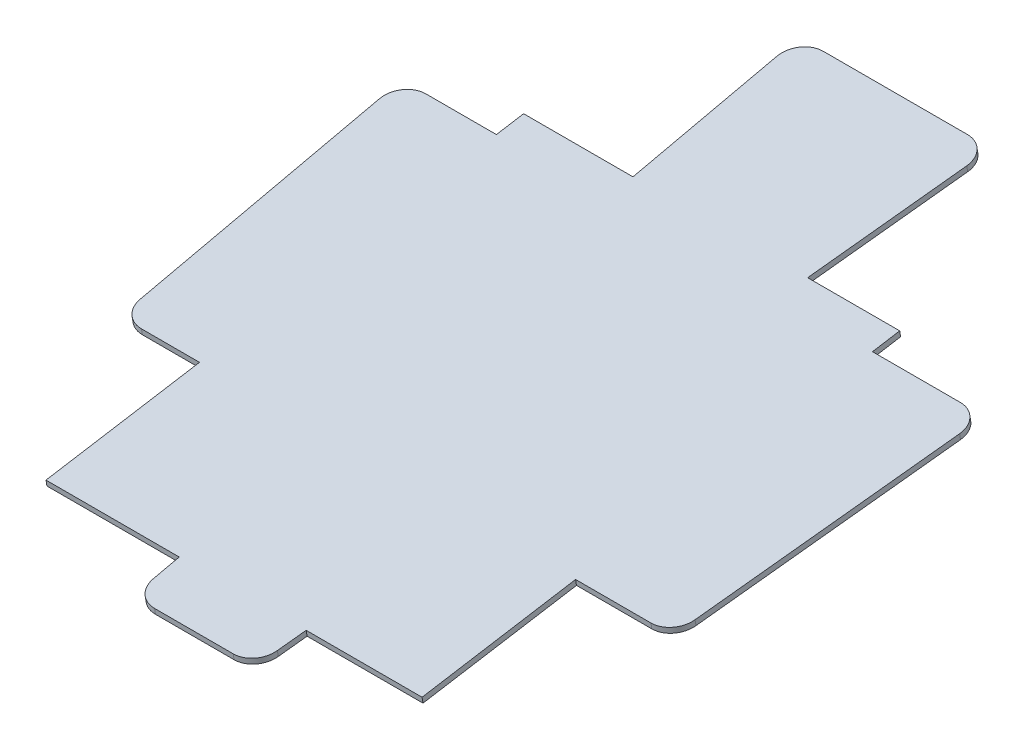
ISO-10303-21;
HEADER;
FILE_DESCRIPTION(('STEP AP214'),'2;1');
FILE_NAME('part.step','',(''),(''),'','','');
FILE_SCHEMA(('AUTOMOTIVE_DESIGN { 1 0 10303 214 1 1 1 1 }'));
ENDSEC;
DATA;
#1=APPLICATION_CONTEXT('core data for automotive mechanical design processes');
#2=APPLICATION_PROTOCOL_DEFINITION('international standard','automotive_design',2000,#1);
#3=PRODUCT_CONTEXT('',#1,'mechanical');
#4=PRODUCT('Part','Part','',(#3));
#5=PRODUCT_RELATED_PRODUCT_CATEGORY('part','',(#4));
#6=PRODUCT_DEFINITION_FORMATION('','',#4);
#7=PRODUCT_DEFINITION_CONTEXT('part definition',#1,'design');
#8=PRODUCT_DEFINITION('design','',#6,#7);
#9=PRODUCT_DEFINITION_SHAPE('','',#8);
#10=(LENGTH_UNIT() NAMED_UNIT(*) SI_UNIT(.MILLI.,.METRE.));
#11=(NAMED_UNIT(*) PLANE_ANGLE_UNIT() SI_UNIT($,.RADIAN.));
#12=(NAMED_UNIT(*) SI_UNIT($,.STERADIAN.) SOLID_ANGLE_UNIT());
#13=UNCERTAINTY_MEASURE_WITH_UNIT(LENGTH_MEASURE(1.E-05),#10,'distance_accuracy_value','');
#14=(GEOMETRIC_REPRESENTATION_CONTEXT(3) GLOBAL_UNCERTAINTY_ASSIGNED_CONTEXT((#13)) GLOBAL_UNIT_ASSIGNED_CONTEXT((#10,
#11,#12)) REPRESENTATION_CONTEXT('',''));
#15=CARTESIAN_POINT('',(0.,0.,0.));
#16=DIRECTION('',(0.,0.,1.));
#17=DIRECTION('',(1.,0.,0.));
#18=AXIS2_PLACEMENT_3D('',#15,#16,#17);
#19=CARTESIAN_POINT('',(35.3768313671058,430.23976657494,1311.19693575289));
#20=DIRECTION('',(0.,-0.16217195826243,0.98676251243819));
#21=DIRECTION('',(0.,-0.98676251243819,-0.16217195826243));
#22=AXIS2_PLACEMENT_3D('',#19,#20,#21);
#23=PLANE('',#22);
#24=DIRECTION('',(1.,0.,0.));
#25=VECTOR('',#24,1.);
#26=CARTESIAN_POINT('',(35.3768313671058,433.372737551937,1311.71183172037));
#27=LINE('',#26,#25);
#28=CARTESIAN_POINT('',(35.3768313671058,433.372737551937,1311.71183172037));
#29=VERTEX_POINT('',#28);
#30=CARTESIAN_POINT('',(99.9999999999999,433.372737551937,1311.71183172037));
#31=VERTEX_POINT('',#30);
#32=EDGE_CURVE('E299',#29,#31,#27,.T.);
#33=ORIENTED_EDGE('',*,*,#32,.F.);
#34=DIRECTION('',(0.,0.98676251243819,0.16217195826243));
#35=VECTOR('',#34,1.);
#36=CARTESIAN_POINT('',(35.3768313671058,430.23976657494,1311.19693575289));
#37=LINE('',#36,#35);
#38=CARTESIAN_POINT('',(35.3768313671058,430.23976657494,1311.19693575289));
#39=VERTEX_POINT('',#38);
#40=EDGE_CURVE('E249',#39,#29,#37,.T.);
#41=ORIENTED_EDGE('',*,*,#40,.F.);
#42=DIRECTION('',(1.,0.,0.));
#43=VECTOR('',#42,1.);
#44=CARTESIAN_POINT('',(35.3768313671058,430.23976657494,1311.19693575289));
#45=LINE('',#44,#43);
#46=CARTESIAN_POINT('',(99.9999999999999,430.23976657494,1311.19693575289));
#47=VERTEX_POINT('',#46);
#48=EDGE_CURVE('E244',#39,#47,#45,.T.);
#49=ORIENTED_EDGE('',*,*,#48,.T.);
#50=DIRECTION('',(0.,0.98676251243819,0.16217195826243));
#51=VECTOR('',#50,1.);
#52=CARTESIAN_POINT('',(99.9999999999999,430.23976657494,1311.19693575289));
#53=LINE('',#52,#51);
#54=EDGE_CURVE('E228',#47,#31,#53,.T.);
#55=ORIENTED_EDGE('',*,*,#54,.T.);
#56=EDGE_LOOP('',(#33,#41,#49,#55));
#57=FACE_BOUND('',#56,.T.);
#58=ADVANCED_FACE('F41',(#57),#23,.T.);
#59=CARTESIAN_POINT('',(35.3768313671058,430.23976657494,1311.19693575289));
#60=DIRECTION('',(0.9987850922731,-0.00799153965595833,0.0486258649994334));
#61=DIRECTION('',(0.0486274178120991,0.,-0.998816987359009));
#62=AXIS2_PLACEMENT_3D('',#59,#60,#61);
#63=PLANE('',#62);
#64=DIRECTION('',(0.0492781843518598,0.161974934297251,-0.985563687037213));
#65=VECTOR('',#64,1.);
#66=CARTESIAN_POINT('',(35.3768313671058,433.372737551937,1311.71183172037));
#67=LINE('',#66,#65);
#68=CARTESIAN_POINT('',(34.6117878065813,430.858077523766,1327.01270293086));
#69=VERTEX_POINT('',#68);
#70=EDGE_CURVE('E250',#69,#29,#67,.T.);
#71=ORIENTED_EDGE('',*,*,#70,.F.);
#72=DIRECTION('',(0.,0.98676251243819,0.16217195826243));
#73=VECTOR('',#72,1.);
#74=CARTESIAN_POINT('',(34.6117878065813,427.725106546769,1326.49780696338));
#75=LINE('',#74,#73);
#76=CARTESIAN_POINT('',(34.6117878065813,427.725106546769,1326.49780696338));
#77=VERTEX_POINT('',#76);
#78=EDGE_CURVE('E394',#69,#77,#75,.F.);
#79=ORIENTED_EDGE('',*,*,#78,.T.);
#80=DIRECTION('',(0.0492781843518598,0.161974934297251,-0.985563687037213));
#81=VECTOR('',#80,1.);
#82=CARTESIAN_POINT('',(35.3768313671058,430.23976657494,1311.19693575289));
#83=LINE('',#82,#81);
#84=EDGE_CURVE('E239',#77,#39,#83,.T.);
#85=ORIENTED_EDGE('',*,*,#84,.T.);
#86=ORIENTED_EDGE('',*,*,#40,.T.);
#87=EDGE_LOOP('',(#71,#79,#85,#86));
#88=FACE_BOUND('',#87,.T.);
#89=ADVANCED_FACE('F461',(#88),#63,.T.);
#90=CARTESIAN_POINT('',(34.0160710354577,425.767015230467,1338.41214238585));
#91=DIRECTION('',(0.,-0.16217195826243,0.98676251243819));
#92=DIRECTION('',(0.,-0.98676251243819,-0.16217195826243));
#93=AXIS2_PLACEMENT_3D('',#90,#91,#92);
#94=PLANE('',#93);
#95=DIRECTION('',(1.,0.,0.));
#96=VECTOR('',#95,1.);
#97=CARTESIAN_POINT('',(34.0160710354577,425.767015230467,1338.41214238585));
#98=LINE('',#97,#96);
#99=CARTESIAN_POINT('',(-21.9272171347127,425.767015230467,1338.41214238585));
#100=VERTEX_POINT('',#99);
#101=CARTESIAN_POINT('',(21.927217134713,425.767015230467,1338.41214238585));
#102=VERTEX_POINT('',#101);
#103=EDGE_CURVE('E295',#100,#102,#98,.T.);
#104=ORIENTED_EDGE('',*,*,#103,.T.);
#105=DIRECTION('',(0.,0.98676251243819,0.16217195826243));
#106=VECTOR('',#105,1.);
#107=CARTESIAN_POINT('',(21.927217134713,425.767015230467,1338.41214238585));
#108=LINE('',#107,#106);
#109=CARTESIAN_POINT('',(21.927217134713,428.899986207464,1338.92703835334));
#110=VERTEX_POINT('',#109);
#111=EDGE_CURVE('E375',#102,#110,#108,.T.);
#112=ORIENTED_EDGE('',*,*,#111,.T.);
#113=DIRECTION('',(1.,0.,0.));
#114=VECTOR('',#113,1.);
#115=CARTESIAN_POINT('',(34.0160710354577,428.899986207464,1338.92703835334));
#116=LINE('',#115,#114);
#117=CARTESIAN_POINT('',(-21.9272171347127,428.899986207464,1338.92703835334));
#118=VERTEX_POINT('',#117);
#119=EDGE_CURVE('E252',#118,#110,#116,.T.);
#120=ORIENTED_EDGE('',*,*,#119,.F.);
#121=DIRECTION('',(0.,0.98676251243819,0.16217195826243));
#122=VECTOR('',#121,1.);
#123=CARTESIAN_POINT('',(-21.9272171347127,425.767015230467,1338.41214238585));
#124=LINE('',#123,#122);
#125=EDGE_CURVE('E350',#118,#100,#124,.F.);
#126=ORIENTED_EDGE('',*,*,#125,.T.);
#127=EDGE_LOOP('',(#104,#112,#120,#126));
#128=FACE_BOUND('',#127,.T.);
#129=ADVANCED_FACE('F469',(#128),#94,.T.);
#130=CARTESIAN_POINT('',(-35.3768313671055,430.23976657494,1311.19693575289));
#131=DIRECTION('',(-0.9987850922731,-0.00799153965595796,0.0486258649994335));
#132=DIRECTION('',(0.0486274178120992,0.,0.998816987359009));
#133=AXIS2_PLACEMENT_3D('',#130,#131,#132);
#134=PLANE('',#133);
#135=DIRECTION('',(0.0492781843518598,-0.161974934297251,0.985563687037213));
#136=VECTOR('',#135,1.);
#137=CARTESIAN_POINT('',(-35.3768313671055,430.23976657494,1311.19693575289));
#138=LINE('',#137,#136);
#139=CARTESIAN_POINT('',(-35.3768313671055,430.23976657494,1311.19693575289));
#140=VERTEX_POINT('',#139);
#141=CARTESIAN_POINT('',(-34.6117878065811,427.725106546769,1326.49780696338));
#142=VERTEX_POINT('',#141);
#143=EDGE_CURVE('E292',#140,#142,#138,.T.);
#144=ORIENTED_EDGE('',*,*,#143,.T.);
#145=DIRECTION('',(0.,0.98676251243819,0.16217195826243));
#146=VECTOR('',#145,1.);
#147=CARTESIAN_POINT('',(-34.6117878065811,427.725106546769,1326.49780696338));
#148=LINE('',#147,#146);
#149=CARTESIAN_POINT('',(-34.6117878065811,430.858077523766,1327.01270293086));
#150=VERTEX_POINT('',#149);
#151=EDGE_CURVE('E410',#142,#150,#148,.T.);
#152=ORIENTED_EDGE('',*,*,#151,.T.);
#153=DIRECTION('',(0.0492781843518598,-0.161974934297251,0.985563687037213));
#154=VECTOR('',#153,1.);
#155=CARTESIAN_POINT('',(-35.3768313671055,433.372737551937,1311.71183172037));
#156=LINE('',#155,#154);
#157=CARTESIAN_POINT('',(-35.3768313671055,433.372737551937,1311.71183172037));
#158=VERTEX_POINT('',#157);
#159=EDGE_CURVE('E344',#158,#150,#156,.T.);
#160=ORIENTED_EDGE('',*,*,#159,.F.);
#161=DIRECTION('',(0.,0.98676251243819,0.16217195826243));
#162=VECTOR('',#161,1.);
#163=CARTESIAN_POINT('',(-35.3768313671055,430.23976657494,1311.19693575289));
#164=LINE('',#163,#162);
#165=EDGE_CURVE('E351',#140,#158,#164,.T.);
#166=ORIENTED_EDGE('',*,*,#165,.F.);
#167=EDGE_LOOP('',(#144,#152,#160,#166));
#168=FACE_BOUND('',#167,.T.);
#169=ADVANCED_FACE('F477',(#168),#134,.T.);
#170=CARTESIAN_POINT('',(-100.,430.23976657494,1311.19693575289));
#171=DIRECTION('',(0.,-0.16217195826243,0.98676251243819));
#172=DIRECTION('',(0.,-0.98676251243819,-0.16217195826243));
#173=AXIS2_PLACEMENT_3D('',#170,#171,#172);
#174=PLANE('',#173);
#175=DIRECTION('',(1.,0.,0.));
#176=VECTOR('',#175,1.);
#177=CARTESIAN_POINT('',(-100.,433.372737551937,1311.71183172037));
#178=LINE('',#177,#176);
#179=CARTESIAN_POINT('',(-109.652,433.372737551937,1311.71183172037));
#180=VERTEX_POINT('',#179);
#181=EDGE_CURVE('E341',#180,#158,#178,.T.);
#182=ORIENTED_EDGE('',*,*,#181,.F.);
#183=DIRECTION('',(0.,0.98676251243819,0.16217195826243));
#184=VECTOR('',#183,1.);
#185=CARTESIAN_POINT('',(-109.652,430.23976657494,1311.19693575289));
#186=LINE('',#185,#184);
#187=CARTESIAN_POINT('',(-109.652,430.23976657494,1311.19693575289));
#188=VERTEX_POINT('',#187);
#189=EDGE_CURVE('E353',#188,#180,#186,.T.);
#190=ORIENTED_EDGE('',*,*,#189,.F.);
#191=DIRECTION('',(1.,0.,0.));
#192=VECTOR('',#191,1.);
#193=CARTESIAN_POINT('',(-100.,430.23976657494,1311.19693575289));
#194=LINE('',#193,#192);
#195=EDGE_CURVE('E290',#188,#140,#194,.T.);
#196=ORIENTED_EDGE('',*,*,#195,.T.);
#197=ORIENTED_EDGE('',*,*,#165,.T.);
#198=EDGE_LOOP('',(#182,#190,#196,#197));
#199=FACE_BOUND('',#198,.T.);
#200=ADVANCED_FACE('F726',(#199),#174,.T.);
#201=CARTESIAN_POINT('',(-109.652,430.23976657494,1311.19693575289));
#202=DIRECTION('',(-1.,0.,0.));
#203=DIRECTION('',(0.,0.,1.));
#204=AXIS2_PLACEMENT_3D('',#201,#202,#203);
#205=PLANE('',#204);
#206=DIRECTION('',(0.,-0.16217195826243,0.98676251243819));
#207=VECTOR('',#206,1.);
#208=CARTESIAN_POINT('',(-109.652,433.372737551937,1311.71183172037));
#209=LINE('',#208,#207);
#210=CARTESIAN_POINT('',(-109.651999999999,447.43624103686,1226.14008318165));
#211=VERTEX_POINT('',#210);
#212=EDGE_CURVE('E338',#211,#180,#209,.T.);
#213=ORIENTED_EDGE('',*,*,#212,.F.);
#214=DIRECTION('',(0.,0.98676251243819,0.16217195826243));
#215=VECTOR('',#214,1.);
#216=CARTESIAN_POINT('',(-109.651999999999,444.303270059863,1225.62518721417));
#217=LINE('',#216,#215);
#218=CARTESIAN_POINT('',(-109.651999999999,444.303270059863,1225.62518721417));
#219=VERTEX_POINT('',#218);
#220=EDGE_CURVE('E356',#219,#211,#217,.T.);
#221=ORIENTED_EDGE('',*,*,#220,.F.);
#222=DIRECTION('',(0.,-0.16217195826243,0.98676251243819));
#223=VECTOR('',#222,1.);
#224=CARTESIAN_POINT('',(-109.652,430.23976657494,1311.19693575289));
#225=LINE('',#224,#223);
#226=EDGE_CURVE('E287',#219,#188,#225,.T.);
#227=ORIENTED_EDGE('',*,*,#226,.T.);
#228=ORIENTED_EDGE('',*,*,#189,.T.);
#229=EDGE_LOOP('',(#213,#221,#227,#228));
#230=FACE_BOUND('',#229,.T.);
#231=ADVANCED_FACE('F487',(#230),#205,.T.);
#232=CARTESIAN_POINT('',(-109.651999999999,444.303270059863,1225.62518721417));
#233=DIRECTION('',(0.,-0.16217195826243,0.98676251243819));
#234=DIRECTION('',(0.,-0.98676251243819,-0.16217195826243));
#235=AXIS2_PLACEMENT_3D('',#232,#233,#234);
#236=PLANE('',#235);
#237=DIRECTION('',(1.,0.,0.));
#238=VECTOR('',#237,1.);
#239=CARTESIAN_POINT('',(-109.651999999999,447.43624103686,1226.14008318165));
#240=LINE('',#239,#238);
#241=CARTESIAN_POINT('',(-142.005597758584,447.43624103686,1226.14008318165));
#242=VERTEX_POINT('',#241);
#243=EDGE_CURVE('E336',#242,#211,#240,.T.);
#244=ORIENTED_EDGE('',*,*,#243,.F.);
#245=DIRECTION('',(0.,0.98676251243819,0.16217195826243));
#246=VECTOR('',#245,1.);
#247=CARTESIAN_POINT('',(-142.005597758584,444.303270059863,1225.62518721417));
#248=LINE('',#247,#246);
#249=CARTESIAN_POINT('',(-142.005597758584,444.303270059863,1225.62518721417));
#250=VERTEX_POINT('',#249);
#251=EDGE_CURVE('E418',#242,#250,#248,.F.);
#252=ORIENTED_EDGE('',*,*,#251,.T.);
#253=DIRECTION('',(1.,0.,0.));
#254=VECTOR('',#253,1.);
#255=CARTESIAN_POINT('',(-109.651999999999,444.303270059863,1225.62518721417));
#256=LINE('',#255,#254);
#257=EDGE_CURVE('E285',#250,#219,#256,.T.);
#258=ORIENTED_EDGE('',*,*,#257,.T.);
#259=ORIENTED_EDGE('',*,*,#220,.T.);
#260=EDGE_LOOP('',(#244,#252,#258,#259));
#261=FACE_BOUND('',#260,.T.);
#262=ADVANCED_FACE('F490',(#261),#236,.T.);
#263=CARTESIAN_POINT('',(-154.094451659329,444.303270059863,1225.62518721417));
#264=DIRECTION('',(-0.9987850922731,-0.00799153965595822,0.0486258649994351));
#265=DIRECTION('',(0.0486274178121008,0.,0.998816987359009));
#266=AXIS2_PLACEMENT_3D('',#263,#264,#265);
#267=PLANE('',#266);
#268=DIRECTION('',(0.0492781843518614,-0.161974934297251,0.985563687037213));
#269=VECTOR('',#268,1.);
#270=CARTESIAN_POINT('',(-154.094451659329,444.303270059863,1225.62518721417));
#271=LINE('',#270,#269);
#272=CARTESIAN_POINT('',(-161.712782277747,469.344342851059,1073.25857484581));
#273=VERTEX_POINT('',#272);
#274=CARTESIAN_POINT('',(-154.690168430453,446.261361376165,1213.71085179169));
#275=VERTEX_POINT('',#274);
#276=EDGE_CURVE('E282',#273,#275,#271,.T.);
#277=ORIENTED_EDGE('',*,*,#276,.T.);
#278=DIRECTION('',(0.,0.98676251243819,0.16217195826243));
#279=VECTOR('',#278,1.);
#280=CARTESIAN_POINT('',(-154.690168430453,446.261361376165,1213.71085179169));
#281=LINE('',#280,#279);
#282=CARTESIAN_POINT('',(-154.690168430453,449.394332353162,1214.22574775918));
#283=VERTEX_POINT('',#282);
#284=EDGE_CURVE('E415',#275,#283,#281,.T.);
#285=ORIENTED_EDGE('',*,*,#284,.T.);
#286=DIRECTION('',(0.0492781843518614,-0.161974934297251,0.985563687037213));
#287=VECTOR('',#286,1.);
#288=CARTESIAN_POINT('',(-154.094451659329,447.43624103686,1226.14008318165));
#289=LINE('',#288,#287);
#290=CARTESIAN_POINT('',(-161.712782277747,472.477313828056,1073.77347081329));
#291=VERTEX_POINT('',#290);
#292=EDGE_CURVE('E333',#291,#283,#289,.T.);
#293=ORIENTED_EDGE('',*,*,#292,.F.);
#294=DIRECTION('',(0.,0.98676251243819,0.16217195826243));
#295=VECTOR('',#294,1.);
#296=CARTESIAN_POINT('',(-161.712782277747,469.344342851059,1073.25857484581));
#297=LINE('',#296,#295);
#298=EDGE_CURVE('E413',#291,#273,#297,.F.);
#299=ORIENTED_EDGE('',*,*,#298,.T.);
#300=EDGE_LOOP('',(#277,#285,#293,#299));
#301=FACE_BOUND('',#300,.T.);
#302=ADVANCED_FACE('F499',(#301),#267,.T.);
#303=CARTESIAN_POINT('',(-109.651999999999,471.505419274623,1060.10914245235));
#304=DIRECTION('',(0.,0.16217195826243,-0.98676251243819));
#305=DIRECTION('',(0.,0.98676251243819,0.16217195826243));
#306=AXIS2_PLACEMENT_3D('',#303,#304,#305);
#307=PLANE('',#306);
#308=DIRECTION('',(-1.,0.,0.));
#309=VECTOR('',#308,1.);
#310=CARTESIAN_POINT('',(-109.651999999999,471.505419274623,1060.10914245235));
#311=LINE('',#310,#309);
#312=CARTESIAN_POINT('',(-109.651999999999,471.505419274623,1060.10914245235));
#313=VERTEX_POINT('',#312);
#314=CARTESIAN_POINT('',(-149.028211605879,471.505419274623,1060.10914245235));
#315=VERTEX_POINT('',#314);
#316=EDGE_CURVE('E279',#313,#315,#311,.T.);
#317=ORIENTED_EDGE('',*,*,#316,.T.);
#318=DIRECTION('',(0.,0.98676251243819,0.16217195826243));
#319=VECTOR('',#318,1.);
#320=CARTESIAN_POINT('',(-149.028211605879,471.505419274623,1060.10914245235));
#321=LINE('',#320,#319);
#322=CARTESIAN_POINT('',(-149.028211605879,474.63839025162,1060.62403841984));
#323=VERTEX_POINT('',#322);
#324=EDGE_CURVE('E420',#315,#323,#321,.T.);
#325=ORIENTED_EDGE('',*,*,#324,.T.);
#326=DIRECTION('',(-1.,0.,0.));
#327=VECTOR('',#326,1.);
#328=CARTESIAN_POINT('',(-109.651999999999,474.63839025162,1060.62403841984));
#329=LINE('',#328,#327);
#330=CARTESIAN_POINT('',(-109.651999999999,474.63839025162,1060.62403841984));
#331=VERTEX_POINT('',#330);
#332=EDGE_CURVE('E330',#331,#323,#329,.T.);
#333=ORIENTED_EDGE('',*,*,#332,.F.);
#334=DIRECTION('',(0.,0.98676251243819,0.16217195826243));
#335=VECTOR('',#334,1.);
#336=CARTESIAN_POINT('',(-109.651999999999,471.505419274623,1060.10914245235));
#337=LINE('',#336,#335);
#338=EDGE_CURVE('E359',#313,#331,#337,.T.);
#339=ORIENTED_EDGE('',*,*,#338,.F.);
#340=EDGE_LOOP('',(#317,#325,#333,#339));
#341=FACE_BOUND('',#340,.T.);
#342=ADVANCED_FACE('F507',(#341),#307,.T.);
#343=CARTESIAN_POINT('',(-109.652,473.997815229318,1044.94374073558));
#344=DIRECTION('',(-1.,0.,0.));
#345=DIRECTION('',(0.,0.,1.));
#346=AXIS2_PLACEMENT_3D('',#343,#344,#345);
#347=PLANE('',#346);
#348=DIRECTION('',(0.,-0.16217195826243,0.98676251243819));
#349=VECTOR('',#348,1.);
#350=CARTESIAN_POINT('',(-109.652,477.130786206315,1045.45863670306));
#351=LINE('',#350,#349);
#352=CARTESIAN_POINT('',(-109.652,477.130786206315,1045.45863670306));
#353=VERTEX_POINT('',#352);
#354=EDGE_CURVE('E327',#353,#331,#351,.T.);
#355=ORIENTED_EDGE('',*,*,#354,.F.);
#356=DIRECTION('',(0.,0.98676251243819,0.16217195826243));
#357=VECTOR('',#356,1.);
#358=CARTESIAN_POINT('',(-109.652,473.997815229318,1044.94374073558));
#359=LINE('',#358,#357);
#360=CARTESIAN_POINT('',(-109.652,473.997815229318,1044.94374073558));
#361=VERTEX_POINT('',#360);
#362=EDGE_CURVE('E361',#361,#353,#359,.T.);
#363=ORIENTED_EDGE('',*,*,#362,.F.);
#364=DIRECTION('',(0.,-0.16217195826243,0.98676251243819));
#365=VECTOR('',#364,1.);
#366=CARTESIAN_POINT('',(-109.652,473.997815229318,1044.94374073558));
#367=LINE('',#366,#365);
#368=EDGE_CURVE('E276',#361,#313,#367,.T.);
#369=ORIENTED_EDGE('',*,*,#368,.T.);
#370=ORIENTED_EDGE('',*,*,#338,.T.);
#371=EDGE_LOOP('',(#355,#363,#369,#370));
#372=FACE_BOUND('',#371,.T.);
#373=ADVANCED_FACE('F514',(#372),#347,.T.);
#374=CARTESIAN_POINT('',(-100.,473.997815229318,1044.94374073558));
#375=DIRECTION('',(0.,0.16217195826243,-0.98676251243819));
#376=DIRECTION('',(0.,0.98676251243819,0.16217195826243));
#377=AXIS2_PLACEMENT_3D('',#374,#375,#376);
#378=PLANE('',#377);
#379=DIRECTION('',(-1.,0.,0.));
#380=VECTOR('',#379,1.);
#381=CARTESIAN_POINT('',(-100.,477.130786206315,1045.45863670306));
#382=LINE('',#381,#380);
#383=CARTESIAN_POINT('',(-48.6894911179712,477.130786206315,1045.45863670306));
#384=VERTEX_POINT('',#383);
#385=EDGE_CURVE('E324',#384,#353,#382,.T.);
#386=ORIENTED_EDGE('',*,*,#385,.F.);
#387=DIRECTION('',(0.,0.98676251243819,0.16217195826243));
#388=VECTOR('',#387,1.);
#389=CARTESIAN_POINT('',(-48.6894911179712,473.997815229318,1044.94374073558));
#390=LINE('',#389,#388);
#391=CARTESIAN_POINT('',(-48.6894911179712,473.997815229318,1044.94374073558));
#392=VERTEX_POINT('',#391);
#393=EDGE_CURVE('E363',#392,#384,#390,.T.);
#394=ORIENTED_EDGE('',*,*,#393,.F.);
#395=DIRECTION('',(-1.,0.,0.));
#396=VECTOR('',#395,1.);
#397=CARTESIAN_POINT('',(-100.,473.997815229318,1044.94374073558));
#398=LINE('',#397,#396);
#399=EDGE_CURVE('E274',#392,#361,#398,.T.);
#400=ORIENTED_EDGE('',*,*,#399,.T.);
#401=ORIENTED_EDGE('',*,*,#362,.T.);
#402=EDGE_LOOP('',(#386,#394,#400,#401));
#403=FACE_BOUND('',#402,.T.);
#404=ADVANCED_FACE('F517',(#403),#378,.T.);
#405=CARTESIAN_POINT('',(-53.5705687907168,490.041674104019,947.322187280667));
#406=DIRECTION('',(-0.9987850922731,-0.0079915396559584,0.0486258649994362));
#407=DIRECTION('',(0.0486274178121019,0.,0.998816987359009));
#408=AXIS2_PLACEMENT_3D('',#405,#406,#407);
#409=PLANE('',#408);
#410=DIRECTION('',(0.0492781843518625,-0.16197493429725,0.985563687037213));
#411=VECTOR('',#410,1.);
#412=CARTESIAN_POINT('',(-53.5705687907168,493.174645081016,947.837083248152));
#413=LINE('',#412,#411);
#414=CARTESIAN_POINT('',(-52.9130971710439,491.013568657452,960.986515641609));
#415=VERTEX_POINT('',#414);
#416=EDGE_CURVE('E322',#415,#384,#413,.T.);
#417=ORIENTED_EDGE('',*,*,#416,.F.);
#418=DIRECTION('',(0.,0.98676251243819,0.16217195826243));
#419=VECTOR('',#418,1.);
#420=CARTESIAN_POINT('',(-52.9130971710439,487.880597680455,960.471619674125));
#421=LINE('',#420,#419);
#422=CARTESIAN_POINT('',(-52.9130971710439,487.880597680455,960.471619674125));
#423=VERTEX_POINT('',#422);
#424=EDGE_CURVE('E428',#415,#423,#421,.F.);
#425=ORIENTED_EDGE('',*,*,#424,.T.);
#426=DIRECTION('',(0.0492781843518625,-0.16197493429725,0.985563687037213));
#427=VECTOR('',#426,1.);
#428=CARTESIAN_POINT('',(-53.5705687907168,490.041674104019,947.322187280667));
#429=LINE('',#428,#427);
#430=EDGE_CURVE('E272',#423,#392,#429,.T.);
#431=ORIENTED_EDGE('',*,*,#430,.T.);
#432=ORIENTED_EDGE('',*,*,#393,.T.);
#433=EDGE_LOOP('',(#417,#425,#431,#432));
#434=FACE_BOUND('',#433,.T.);
#435=ADVANCED_FACE('F694',(#434),#409,.T.);
#436=CARTESIAN_POINT('',(53.5705687907169,490.041674104019,947.322187280667));
#437=DIRECTION('',(0.,0.16217195826243,-0.98676251243819));
#438=DIRECTION('',(0.,0.98676251243819,0.16217195826243));
#439=AXIS2_PLACEMENT_3D('',#436,#437,#438);
#440=PLANE('',#439);
#441=DIRECTION('',(-1.,0.,0.));
#442=VECTOR('',#441,1.);
#443=CARTESIAN_POINT('',(53.5705687907169,490.041674104019,947.322187280667));
#444=LINE('',#443,#442);
#445=CARTESIAN_POINT('',(40.2285264991756,490.041674104019,947.322187280667));
#446=VERTEX_POINT('',#445);
#447=CARTESIAN_POINT('',(-40.2285264991756,490.041674104019,947.322187280667));
#448=VERTEX_POINT('',#447);
#449=EDGE_CURVE('E269',#446,#448,#444,.T.);
#450=ORIENTED_EDGE('',*,*,#449,.T.);
#451=DIRECTION('',(0.,0.98676251243819,0.16217195826243));
#452=VECTOR('',#451,1.);
#453=CARTESIAN_POINT('',(-40.2285264991756,490.041674104019,947.322187280667));
#454=LINE('',#453,#452);
#455=CARTESIAN_POINT('',(-40.2285264991756,493.174645081016,947.837083248152));
#456=VERTEX_POINT('',#455);
#457=EDGE_CURVE('E425',#448,#456,#454,.T.);
#458=ORIENTED_EDGE('',*,*,#457,.T.);
#459=DIRECTION('',(-1.,0.,0.));
#460=VECTOR('',#459,1.);
#461=CARTESIAN_POINT('',(53.5705687907169,493.174645081016,947.837083248152));
#462=LINE('',#461,#460);
#463=CARTESIAN_POINT('',(40.2285264991756,493.174645081016,947.837083248152));
#464=VERTEX_POINT('',#463);
#465=EDGE_CURVE('E319',#464,#456,#462,.T.);
#466=ORIENTED_EDGE('',*,*,#465,.F.);
#467=DIRECTION('',(0.,0.98676251243819,0.16217195826243));
#468=VECTOR('',#467,1.);
#469=CARTESIAN_POINT('',(40.2285264991756,490.041674104019,947.322187280667));
#470=LINE('',#469,#468);
#471=EDGE_CURVE('E423',#464,#446,#470,.F.);
#472=ORIENTED_EDGE('',*,*,#471,.T.);
#473=EDGE_LOOP('',(#450,#458,#466,#472));
#474=FACE_BOUND('',#473,.T.);
#475=ADVANCED_FACE('F529',(#474),#440,.T.);
#476=CARTESIAN_POINT('',(53.5705687907169,490.041674104019,947.322187280667));
#477=DIRECTION('',(0.9987850922731,-0.00799153965595841,0.0486258649994339));
#478=DIRECTION('',(0.0486274178120996,0.,-0.998816987359009));
#479=AXIS2_PLACEMENT_3D('',#476,#477,#478);
#480=PLANE('',#479);
#481=DIRECTION('',(0.0492781843518603,0.16197493429725,-0.985563687037213));
#482=VECTOR('',#481,1.);
#483=CARTESIAN_POINT('',(53.5705687907169,490.041674104019,947.322187280667));
#484=LINE('',#483,#482);
#485=CARTESIAN_POINT('',(48.6894911179714,473.997815229318,1044.94374073558));
#486=VERTEX_POINT('',#485);
#487=CARTESIAN_POINT('',(52.913097171044,487.880597680455,960.471619674125));
#488=VERTEX_POINT('',#487);
#489=EDGE_CURVE('E266',#486,#488,#484,.T.);
#490=ORIENTED_EDGE('',*,*,#489,.T.);
#491=DIRECTION('',(0.,0.98676251243819,0.16217195826243));
#492=VECTOR('',#491,1.);
#493=CARTESIAN_POINT('',(52.913097171044,487.880597680455,960.471619674125));
#494=LINE('',#493,#492);
#495=CARTESIAN_POINT('',(52.913097171044,491.013568657452,960.986515641609));
#496=VERTEX_POINT('',#495);
#497=EDGE_CURVE('E430',#488,#496,#494,.T.);
#498=ORIENTED_EDGE('',*,*,#497,.T.);
#499=DIRECTION('',(0.0492781843518603,0.16197493429725,-0.985563687037213));
#500=VECTOR('',#499,1.);
#501=CARTESIAN_POINT('',(53.5705687907169,493.174645081016,947.837083248152));
#502=LINE('',#501,#500);
#503=CARTESIAN_POINT('',(48.6894911179714,477.130786206315,1045.45863670306));
#504=VERTEX_POINT('',#503);
#505=EDGE_CURVE('E316',#504,#496,#502,.T.);
#506=ORIENTED_EDGE('',*,*,#505,.F.);
#507=DIRECTION('',(0.,0.98676251243819,0.16217195826243));
#508=VECTOR('',#507,1.);
#509=CARTESIAN_POINT('',(48.6894911179714,473.997815229318,1044.94374073558));
#510=LINE('',#509,#508);
#511=EDGE_CURVE('E366',#486,#504,#510,.T.);
#512=ORIENTED_EDGE('',*,*,#511,.F.);
#513=EDGE_LOOP('',(#490,#498,#506,#512));
#514=FACE_BOUND('',#513,.T.);
#515=ADVANCED_FACE('F538',(#514),#480,.T.);
#516=CARTESIAN_POINT('',(48.6894911179714,473.997815229318,1044.94374073558));
#517=DIRECTION('',(0.,0.16217195826243,-0.98676251243819));
#518=DIRECTION('',(0.,0.98676251243819,0.16217195826243));
#519=AXIS2_PLACEMENT_3D('',#516,#517,#518);
#520=PLANE('',#519);
#521=DIRECTION('',(-1.,0.,0.));
#522=VECTOR('',#521,1.);
#523=CARTESIAN_POINT('',(48.6894911179714,477.130786206315,1045.45863670306));
#524=LINE('',#523,#522);
#525=CARTESIAN_POINT('',(99.9999999999999,477.130786206315,1045.45863670306));
#526=VERTEX_POINT('',#525);
#527=EDGE_CURVE('E313',#526,#504,#524,.T.);
#528=ORIENTED_EDGE('',*,*,#527,.F.);
#529=DIRECTION('',(0.,0.98676251243819,0.16217195826243));
#530=VECTOR('',#529,1.);
#531=CARTESIAN_POINT('',(99.9999999999999,473.997815229318,1044.94374073558));
#532=LINE('',#531,#530);
#533=CARTESIAN_POINT('',(99.9999999999999,473.997815229318,1044.94374073558));
#534=VERTEX_POINT('',#533);
#535=EDGE_CURVE('E368',#534,#526,#532,.T.);
#536=ORIENTED_EDGE('',*,*,#535,.F.);
#537=DIRECTION('',(-1.,0.,0.));
#538=VECTOR('',#537,1.);
#539=CARTESIAN_POINT('',(48.6894911179714,473.997815229318,1044.94374073558));
#540=LINE('',#539,#538);
#541=EDGE_CURVE('E263',#534,#486,#540,.T.);
#542=ORIENTED_EDGE('',*,*,#541,.T.);
#543=ORIENTED_EDGE('',*,*,#511,.T.);
#544=EDGE_LOOP('',(#528,#536,#542,#543));
#545=FACE_BOUND('',#544,.T.);
#546=ADVANCED_FACE('F542',(#545),#520,.T.);
#547=CARTESIAN_POINT('',(99.9999999999999,473.997815229318,1044.94374073558));
#548=DIRECTION('',(1.,0.,0.));
#549=DIRECTION('',(0.,0.,-1.));
#550=AXIS2_PLACEMENT_3D('',#547,#548,#549);
#551=PLANE('',#550);
#552=DIRECTION('',(0.,0.162171958262433,-0.986762512438189));
#553=VECTOR('',#552,1.);
#554=CARTESIAN_POINT('',(99.9999999999999,477.130786206315,1045.45863670306));
#555=LINE('',#554,#553);
#556=CARTESIAN_POINT('',(100.,474.63839025162,1060.62403841984));
#557=VERTEX_POINT('',#556);
#558=EDGE_CURVE('E310',#557,#526,#555,.T.);
#559=ORIENTED_EDGE('',*,*,#558,.F.);
#560=DIRECTION('',(0.,0.98676251243819,0.16217195826243));
#561=VECTOR('',#560,1.);
#562=CARTESIAN_POINT('',(100.,471.505419274623,1060.10914245235));
#563=LINE('',#562,#561);
#564=CARTESIAN_POINT('',(100.,471.505419274623,1060.10914245235));
#565=VERTEX_POINT('',#564);
#566=EDGE_CURVE('E370',#565,#557,#563,.T.);
#567=ORIENTED_EDGE('',*,*,#566,.F.);
#568=DIRECTION('',(0.,0.162171958262433,-0.986762512438189));
#569=VECTOR('',#568,1.);
#570=CARTESIAN_POINT('',(99.9999999999999,473.997815229318,1044.94374073558));
#571=LINE('',#570,#569);
#572=EDGE_CURVE('E260',#565,#534,#571,.T.);
#573=ORIENTED_EDGE('',*,*,#572,.T.);
#574=ORIENTED_EDGE('',*,*,#535,.T.);
#575=EDGE_LOOP('',(#559,#567,#573,#574));
#576=FACE_BOUND('',#575,.T.);
#577=ADVANCED_FACE('F545',(#576),#551,.T.);
#578=CARTESIAN_POINT('',(162.37025389742,471.505419274623,1060.10914245235));
#579=DIRECTION('',(0.,0.16217195826243,-0.98676251243819));
#580=DIRECTION('',(0.,0.98676251243819,0.16217195826243));
#581=AXIS2_PLACEMENT_3D('',#578,#579,#580);
#582=PLANE('',#581);
#583=DIRECTION('',(-1.,0.,0.));
#584=VECTOR('',#583,1.);
#585=CARTESIAN_POINT('',(162.37025389742,474.63839025162,1060.62403841984));
#586=LINE('',#585,#584);
#587=CARTESIAN_POINT('',(149.028211605879,474.63839025162,1060.62403841984));
#588=VERTEX_POINT('',#587);
#589=EDGE_CURVE('E308',#588,#557,#586,.T.);
#590=ORIENTED_EDGE('',*,*,#589,.F.);
#591=DIRECTION('',(0.,0.98676251243819,0.16217195826243));
#592=VECTOR('',#591,1.);
#593=CARTESIAN_POINT('',(149.028211605879,471.505419274623,1060.10914245235));
#594=LINE('',#593,#592);
#595=CARTESIAN_POINT('',(149.028211605879,471.505419274623,1060.10914245235));
#596=VERTEX_POINT('',#595);
#597=EDGE_CURVE('E49',#588,#596,#594,.F.);
#598=ORIENTED_EDGE('',*,*,#597,.T.);
#599=DIRECTION('',(-1.,0.,0.));
#600=VECTOR('',#599,1.);
#601=CARTESIAN_POINT('',(162.37025389742,471.505419274623,1060.10914245235));
#602=LINE('',#601,#600);
#603=EDGE_CURVE('E258',#596,#565,#602,.T.);
#604=ORIENTED_EDGE('',*,*,#603,.T.);
#605=ORIENTED_EDGE('',*,*,#566,.T.);
#606=EDGE_LOOP('',(#590,#598,#604,#605));
#607=FACE_BOUND('',#606,.T.);
#608=ADVANCED_FACE('F440',(#607),#582,.T.);
#609=CARTESIAN_POINT('',(154.094451659329,444.303270059863,1225.62518721417));
#610=DIRECTION('',(0.9987850922731,-0.00799153965595867,0.0486258649994355));
#611=DIRECTION('',(0.0486274178121012,0.,-0.998816987359009));
#612=AXIS2_PLACEMENT_3D('',#609,#610,#611);
#613=PLANE('',#612);
#614=DIRECTION('',(0.0492781843518619,0.16197493429725,-0.985563687037213));
#615=VECTOR('',#614,1.);
#616=CARTESIAN_POINT('',(154.094451659329,444.303270059863,1225.62518721417));
#617=LINE('',#616,#615);
#618=CARTESIAN_POINT('',(154.690168430453,446.261361376165,1213.71085179169));
#619=VERTEX_POINT('',#618);
#620=CARTESIAN_POINT('',(161.712782277747,469.344342851059,1073.25857484581));
#621=VERTEX_POINT('',#620);
#622=EDGE_CURVE('E256',#619,#621,#617,.T.);
#623=ORIENTED_EDGE('',*,*,#622,.T.);
#624=DIRECTION('',(0.,0.98676251243819,0.16217195826243));
#625=VECTOR('',#624,1.);
#626=CARTESIAN_POINT('',(161.712782277747,469.344342851059,1073.25857484581));
#627=LINE('',#626,#625);
#628=CARTESIAN_POINT('',(161.712782277747,472.477313828056,1073.77347081329));
#629=VERTEX_POINT('',#628);
#630=EDGE_CURVE('E435',#621,#629,#627,.T.);
#631=ORIENTED_EDGE('',*,*,#630,.T.);
#632=DIRECTION('',(0.0492781843518619,0.16197493429725,-0.985563687037213));
#633=VECTOR('',#632,1.);
#634=CARTESIAN_POINT('',(154.094451659329,447.43624103686,1226.14008318165));
#635=LINE('',#634,#633);
#636=CARTESIAN_POINT('',(154.690168430453,449.394332353162,1214.22574775918));
#637=VERTEX_POINT('',#636);
#638=EDGE_CURVE('E305',#637,#629,#635,.T.);
#639=ORIENTED_EDGE('',*,*,#638,.F.);
#640=DIRECTION('',(0.,0.98676251243819,0.16217195826243));
#641=VECTOR('',#640,1.);
#642=CARTESIAN_POINT('',(154.690168430453,446.261361376165,1213.71085179169));
#643=LINE('',#642,#641);
#644=EDGE_CURVE('E433',#637,#619,#643,.F.);
#645=ORIENTED_EDGE('',*,*,#644,.T.);
#646=EDGE_LOOP('',(#623,#631,#639,#645));
#647=FACE_BOUND('',#646,.T.);
#648=ADVANCED_FACE('F449',(#647),#613,.T.);
#649=CARTESIAN_POINT('',(154.094451659329,444.303270059863,1225.62518721417));
#650=DIRECTION('',(0.,-0.16217195826243,0.98676251243819));
#651=DIRECTION('',(0.,-0.98676251243819,-0.16217195826243));
#652=AXIS2_PLACEMENT_3D('',#649,#650,#651);
#653=PLANE('',#652);
#654=DIRECTION('',(1.,0.,0.));
#655=VECTOR('',#654,1.);
#656=CARTESIAN_POINT('',(154.094451659329,444.303270059863,1225.62518721417));
#657=LINE('',#656,#655);
#658=CARTESIAN_POINT('',(100.,444.303270059863,1225.62518721417));
#659=VERTEX_POINT('',#658);
#660=CARTESIAN_POINT('',(142.005597758584,444.303270059863,1225.62518721417));
#661=VERTEX_POINT('',#660);
#662=EDGE_CURVE('E245',#659,#661,#657,.T.);
#663=ORIENTED_EDGE('',*,*,#662,.T.);
#664=DIRECTION('',(0.,0.98676251243819,0.16217195826243));
#665=VECTOR('',#664,1.);
#666=CARTESIAN_POINT('',(142.005597758584,444.303270059863,1225.62518721417));
#667=LINE('',#666,#665);
#668=CARTESIAN_POINT('',(142.005597758584,447.43624103686,1226.14008318165));
#669=VERTEX_POINT('',#668);
#670=EDGE_CURVE('E11',#661,#669,#667,.T.);
#671=ORIENTED_EDGE('',*,*,#670,.T.);
#672=DIRECTION('',(1.,0.,0.));
#673=VECTOR('',#672,1.);
#674=CARTESIAN_POINT('',(154.094451659329,447.43624103686,1226.14008318165));
#675=LINE('',#674,#673);
#676=CARTESIAN_POINT('',(100.,447.43624103686,1226.14008318165));
#677=VERTEX_POINT('',#676);
#678=EDGE_CURVE('E302',#677,#669,#675,.T.);
#679=ORIENTED_EDGE('',*,*,#678,.F.);
#680=DIRECTION('',(0.,0.98676251243819,0.16217195826243));
#681=VECTOR('',#680,1.);
#682=CARTESIAN_POINT('',(100.,444.303270059863,1225.62518721417));
#683=LINE('',#682,#681);
#684=EDGE_CURVE('E238',#659,#677,#683,.T.);
#685=ORIENTED_EDGE('',*,*,#684,.F.);
#686=EDGE_LOOP('',(#663,#671,#679,#685));
#687=FACE_BOUND('',#686,.T.);
#688=ADVANCED_FACE('F457',(#687),#653,.T.);
#689=CARTESIAN_POINT('',(99.9999999999999,430.23976657494,1311.19693575289));
#690=DIRECTION('',(1.,0.,0.));
#691=DIRECTION('',(0.,0.,-1.));
#692=AXIS2_PLACEMENT_3D('',#689,#690,#691);
#693=PLANE('',#692);
#694=DIRECTION('',(0.,0.16217195826243,-0.98676251243819));
#695=VECTOR('',#694,1.);
#696=CARTESIAN_POINT('',(99.9999999999999,433.372737551937,1311.71183172037));
#697=LINE('',#696,#695);
#698=EDGE_CURVE('E233',#31,#677,#697,.T.);
#699=ORIENTED_EDGE('',*,*,#698,.F.);
#700=ORIENTED_EDGE('',*,*,#54,.F.);
#701=DIRECTION('',(0.,0.16217195826243,-0.98676251243819));
#702=VECTOR('',#701,1.);
#703=CARTESIAN_POINT('',(99.9999999999999,430.23976657494,1311.19693575289));
#704=LINE('',#703,#702);
#705=EDGE_CURVE('E231',#47,#659,#704,.T.);
#706=ORIENTED_EDGE('',*,*,#705,.T.);
#707=ORIENTED_EDGE('',*,*,#684,.T.);
#708=EDGE_LOOP('',(#699,#700,#706,#707));
#709=FACE_BOUND('',#708,.T.);
#710=ADVANCED_FACE('F230',(#709),#693,.T.);
#711=CARTESIAN_POINT('',(1.85365436099015E-13,628.749134495808,103.333352363627));
#712=DIRECTION('',(0.,0.98676251243819,0.16217195826243));
#713=DIRECTION('',(0.,-0.16217195826243,0.98676251243819));
#714=AXIS2_PLACEMENT_3D('',#711,#712,#713);
#715=PLANE('',#714);
#716=ORIENTED_EDGE('',*,*,#84,.F.);
#717=CARTESIAN_POINT('',(21.927217134713,427.8265991004,1325.88025847789));
#718=DIRECTION('',(0.,0.98676251243819,0.16217195826243));
#719=DIRECTION('',(0.,-0.16217195826243,0.98676251243819));
#720=AXIS2_PLACEMENT_3D('',#717,#718,#719);
#721=CIRCLE('',#720,12.7);
#722=EDGE_CURVE('E408',#77,#102,#721,.F.);
#723=ORIENTED_EDGE('',*,*,#722,.T.);
#724=ORIENTED_EDGE('',*,*,#103,.F.);
#725=CARTESIAN_POINT('',(-21.9272171347127,427.8265991004,1325.88025847789));
#726=DIRECTION('',(0.,0.98676251243819,0.16217195826243));
#727=DIRECTION('',(0.,-0.16217195826243,0.98676251243819));
#728=AXIS2_PLACEMENT_3D('',#725,#726,#727);
#729=CIRCLE('',#728,12.7);
#730=EDGE_CURVE('E406',#100,#142,#729,.F.);
#731=ORIENTED_EDGE('',*,*,#730,.T.);
#732=ORIENTED_EDGE('',*,*,#143,.F.);
#733=ORIENTED_EDGE('',*,*,#195,.F.);
#734=ORIENTED_EDGE('',*,*,#226,.F.);
#735=ORIENTED_EDGE('',*,*,#257,.F.);
#736=CARTESIAN_POINT('',(-142.005597758584,446.362853929796,1213.0933033062));
#737=DIRECTION('',(0.,0.98676251243819,0.16217195826243));
#738=DIRECTION('',(0.,-0.16217195826243,0.98676251243819));
#739=AXIS2_PLACEMENT_3D('',#736,#737,#738);
#740=CIRCLE('',#739,12.7);
#741=EDGE_CURVE('E404',#250,#275,#740,.F.);
#742=ORIENTED_EDGE('',*,*,#741,.T.);
#743=ORIENTED_EDGE('',*,*,#276,.F.);
#744=CARTESIAN_POINT('',(-149.028211605879,469.44583540469,1072.64102636032));
#745=DIRECTION('',(0.,0.98676251243819,0.16217195826243));
#746=DIRECTION('',(0.,-0.16217195826243,0.98676251243819));
#747=AXIS2_PLACEMENT_3D('',#744,#745,#746);
#748=CIRCLE('',#747,12.7);
#749=EDGE_CURVE('E402',#273,#315,#748,.F.);
#750=ORIENTED_EDGE('',*,*,#749,.T.);
#751=ORIENTED_EDGE('',*,*,#316,.F.);
#752=ORIENTED_EDGE('',*,*,#368,.F.);
#753=ORIENTED_EDGE('',*,*,#399,.F.);
#754=ORIENTED_EDGE('',*,*,#430,.F.);
#755=CARTESIAN_POINT('',(-40.2285264991756,487.982090234086,959.854071188632));
#756=DIRECTION('',(0.,0.98676251243819,0.16217195826243));
#757=DIRECTION('',(0.,-0.16217195826243,0.98676251243819));
#758=AXIS2_PLACEMENT_3D('',#755,#756,#757);
#759=CIRCLE('',#758,12.7);
#760=EDGE_CURVE('E400',#423,#448,#759,.F.);
#761=ORIENTED_EDGE('',*,*,#760,.T.);
#762=ORIENTED_EDGE('',*,*,#449,.F.);
#763=CARTESIAN_POINT('',(40.2285264991756,487.982090234086,959.854071188632));
#764=DIRECTION('',(0.,0.98676251243819,0.16217195826243));
#765=DIRECTION('',(0.,-0.16217195826243,0.98676251243819));
#766=AXIS2_PLACEMENT_3D('',#763,#764,#765);
#767=CIRCLE('',#766,12.7);
#768=EDGE_CURVE('E398',#446,#488,#767,.F.);
#769=ORIENTED_EDGE('',*,*,#768,.T.);
#770=ORIENTED_EDGE('',*,*,#489,.F.);
#771=ORIENTED_EDGE('',*,*,#541,.F.);
#772=ORIENTED_EDGE('',*,*,#572,.F.);
#773=ORIENTED_EDGE('',*,*,#603,.F.);
#774=CARTESIAN_POINT('',(149.028211605879,469.44583540469,1072.64102636032));
#775=DIRECTION('',(0.,0.98676251243819,0.16217195826243));
#776=DIRECTION('',(0.,-0.16217195826243,0.98676251243819));
#777=AXIS2_PLACEMENT_3D('',#774,#775,#776);
#778=CIRCLE('',#777,12.7);
#779=EDGE_CURVE('E62',#596,#621,#778,.F.);
#780=ORIENTED_EDGE('',*,*,#779,.T.);
#781=ORIENTED_EDGE('',*,*,#622,.F.);
#782=CARTESIAN_POINT('',(142.005597758584,446.362853929796,1213.0933033062));
#783=DIRECTION('',(0.,0.98676251243819,0.16217195826243));
#784=DIRECTION('',(0.,-0.16217195826243,0.98676251243819));
#785=AXIS2_PLACEMENT_3D('',#782,#783,#784);
#786=CIRCLE('',#785,12.7);
#787=EDGE_CURVE('E56',#619,#661,#786,.F.);
#788=ORIENTED_EDGE('',*,*,#787,.T.);
#789=ORIENTED_EDGE('',*,*,#662,.F.);
#790=ORIENTED_EDGE('',*,*,#705,.F.);
#791=ORIENTED_EDGE('',*,*,#48,.F.);
#792=EDGE_LOOP('',(#716,#723,#724,#731,#732,#733,#734,#735,#742,#743,#750,#751,#752,#753,#754,
#761,#762,#769,#770,#771,#772,#773,#780,#781,#788,#789,#790,#791));
#793=FACE_BOUND('',#792,.T.);
#794=ADVANCED_FACE('F243',(#793),#715,.F.);
#795=CARTESIAN_POINT('',(1.85963642740219E-13,631.882105472805,103.848248331111));
#796=DIRECTION('',(0.,0.98676251243819,0.16217195826243));
#797=DIRECTION('',(0.,-0.16217195826243,0.98676251243819));
#798=AXIS2_PLACEMENT_3D('',#795,#796,#797);
#799=PLANE('',#798);
#800=ORIENTED_EDGE('',*,*,#119,.T.);
#801=CARTESIAN_POINT('',(21.927217134713,430.959570077397,1326.39515444537));
#802=DIRECTION('',(0.,0.98676251243819,0.16217195826243));
#803=DIRECTION('',(0.,-0.16217195826243,0.98676251243819));
#804=AXIS2_PLACEMENT_3D('',#801,#802,#803);
#805=CIRCLE('',#804,12.7);
#806=EDGE_CURVE('E392',#110,#69,#805,.T.);
#807=ORIENTED_EDGE('',*,*,#806,.T.);
#808=ORIENTED_EDGE('',*,*,#70,.T.);
#809=ORIENTED_EDGE('',*,*,#32,.T.);
#810=ORIENTED_EDGE('',*,*,#698,.T.);
#811=ORIENTED_EDGE('',*,*,#678,.T.);
#812=CARTESIAN_POINT('',(142.005597758584,449.495824906793,1213.60819927368));
#813=DIRECTION('',(0.,0.98676251243819,0.16217195826243));
#814=DIRECTION('',(0.,-0.16217195826243,0.98676251243819));
#815=AXIS2_PLACEMENT_3D('',#812,#813,#814);
#816=CIRCLE('',#815,12.7);
#817=EDGE_CURVE('E378',#669,#637,#816,.T.);
#818=ORIENTED_EDGE('',*,*,#817,.T.);
#819=ORIENTED_EDGE('',*,*,#638,.T.);
#820=CARTESIAN_POINT('',(149.028211605879,472.578806381687,1073.1559223278));
#821=DIRECTION('',(0.,0.98676251243819,0.16217195826243));
#822=DIRECTION('',(0.,-0.16217195826243,0.98676251243819));
#823=AXIS2_PLACEMENT_3D('',#820,#821,#822);
#824=CIRCLE('',#823,12.7);
#825=EDGE_CURVE('E380',#629,#588,#824,.T.);
#826=ORIENTED_EDGE('',*,*,#825,.T.);
#827=ORIENTED_EDGE('',*,*,#589,.T.);
#828=ORIENTED_EDGE('',*,*,#558,.T.);
#829=ORIENTED_EDGE('',*,*,#527,.T.);
#830=ORIENTED_EDGE('',*,*,#505,.T.);
#831=CARTESIAN_POINT('',(40.2285264991756,491.115061211083,960.368967156117));
#832=DIRECTION('',(0.,0.98676251243819,0.16217195826243));
#833=DIRECTION('',(0.,-0.16217195826243,0.98676251243819));
#834=AXIS2_PLACEMENT_3D('',#831,#832,#833);
#835=CIRCLE('',#834,12.7);
#836=EDGE_CURVE('E382',#496,#464,#835,.T.);
#837=ORIENTED_EDGE('',*,*,#836,.T.);
#838=ORIENTED_EDGE('',*,*,#465,.T.);
#839=CARTESIAN_POINT('',(-40.2285264991756,491.115061211083,960.368967156117));
#840=DIRECTION('',(0.,0.98676251243819,0.16217195826243));
#841=DIRECTION('',(0.,-0.16217195826243,0.98676251243819));
#842=AXIS2_PLACEMENT_3D('',#839,#840,#841);
#843=CIRCLE('',#842,12.7);
#844=EDGE_CURVE('E384',#456,#415,#843,.T.);
#845=ORIENTED_EDGE('',*,*,#844,.T.);
#846=ORIENTED_EDGE('',*,*,#416,.T.);
#847=ORIENTED_EDGE('',*,*,#385,.T.);
#848=ORIENTED_EDGE('',*,*,#354,.T.);
#849=ORIENTED_EDGE('',*,*,#332,.T.);
#850=CARTESIAN_POINT('',(-149.028211605879,472.578806381687,1073.1559223278));
#851=DIRECTION('',(0.,0.98676251243819,0.16217195826243));
#852=DIRECTION('',(0.,-0.16217195826243,0.98676251243819));
#853=AXIS2_PLACEMENT_3D('',#850,#851,#852);
#854=CIRCLE('',#853,12.7);
#855=EDGE_CURVE('E386',#323,#291,#854,.T.);
#856=ORIENTED_EDGE('',*,*,#855,.T.);
#857=ORIENTED_EDGE('',*,*,#292,.T.);
#858=CARTESIAN_POINT('',(-142.005597758584,449.495824906793,1213.60819927368));
#859=DIRECTION('',(0.,0.98676251243819,0.16217195826243));
#860=DIRECTION('',(0.,-0.16217195826243,0.98676251243819));
#861=AXIS2_PLACEMENT_3D('',#858,#859,#860);
#862=CIRCLE('',#861,12.7);
#863=EDGE_CURVE('E388',#283,#242,#862,.T.);
#864=ORIENTED_EDGE('',*,*,#863,.T.);
#865=ORIENTED_EDGE('',*,*,#243,.T.);
#866=ORIENTED_EDGE('',*,*,#212,.T.);
#867=ORIENTED_EDGE('',*,*,#181,.T.);
#868=ORIENTED_EDGE('',*,*,#159,.T.);
#869=CARTESIAN_POINT('',(-21.9272171347127,430.959570077397,1326.39515444537));
#870=DIRECTION('',(0.,0.98676251243819,0.16217195826243));
#871=DIRECTION('',(0.,-0.16217195826243,0.98676251243819));
#872=AXIS2_PLACEMENT_3D('',#869,#870,#871);
#873=CIRCLE('',#872,12.7);
#874=EDGE_CURVE('E390',#150,#118,#873,.T.);
#875=ORIENTED_EDGE('',*,*,#874,.T.);
#876=EDGE_LOOP('',(#800,#807,#808,#809,#810,#811,#818,#819,#826,#827,#828,#829,#830,#837,#838,
#845,#846,#847,#848,#849,#856,#857,#864,#865,#866,#867,#868,#875));
#877=FACE_BOUND('',#876,.T.);
#878=ADVANCED_FACE('F452',(#877),#799,.T.);
#879=CARTESIAN_POINT('',(21.927217134713,427.8265991004,1325.88025847789));
#880=DIRECTION('',(0.,0.98676251243819,0.16217195826243));
#881=DIRECTION('',(0.,-0.16217195826243,0.98676251243819));
#882=AXIS2_PLACEMENT_3D('',#879,#880,#881);
#883=CYLINDRICAL_SURFACE('',#882,12.7);
#884=ORIENTED_EDGE('',*,*,#722,.F.);
#885=ORIENTED_EDGE('',*,*,#78,.F.);
#886=ORIENTED_EDGE('',*,*,#806,.F.);
#887=ORIENTED_EDGE('',*,*,#111,.F.);
#888=EDGE_LOOP('',(#884,#885,#886,#887));
#889=FACE_BOUND('',#888,.T.);
#890=ADVANCED_FACE('F466',(#889),#883,.T.);
#891=CARTESIAN_POINT('',(-21.9272171347127,427.8265991004,1325.88025847789));
#892=DIRECTION('',(0.,0.98676251243819,0.16217195826243));
#893=DIRECTION('',(0.,-0.16217195826243,0.98676251243819));
#894=AXIS2_PLACEMENT_3D('',#891,#892,#893);
#895=CYLINDRICAL_SURFACE('',#894,12.7);
#896=ORIENTED_EDGE('',*,*,#730,.F.);
#897=ORIENTED_EDGE('',*,*,#125,.F.);
#898=ORIENTED_EDGE('',*,*,#874,.F.);
#899=ORIENTED_EDGE('',*,*,#151,.F.);
#900=EDGE_LOOP('',(#896,#897,#898,#899));
#901=FACE_BOUND('',#900,.T.);
#902=ADVANCED_FACE('F475',(#901),#895,.T.);
#903=CARTESIAN_POINT('',(-142.005597758584,446.362853929796,1213.0933033062));
#904=DIRECTION('',(0.,0.98676251243819,0.16217195826243));
#905=DIRECTION('',(0.,-0.16217195826243,0.98676251243819));
#906=AXIS2_PLACEMENT_3D('',#903,#904,#905);
#907=CYLINDRICAL_SURFACE('',#906,12.7);
#908=ORIENTED_EDGE('',*,*,#741,.F.);
#909=ORIENTED_EDGE('',*,*,#251,.F.);
#910=ORIENTED_EDGE('',*,*,#863,.F.);
#911=ORIENTED_EDGE('',*,*,#284,.F.);
#912=EDGE_LOOP('',(#908,#909,#910,#911));
#913=FACE_BOUND('',#912,.T.);
#914=ADVANCED_FACE('F496',(#913),#907,.T.);
#915=CARTESIAN_POINT('',(-149.028211605879,469.44583540469,1072.64102636032));
#916=DIRECTION('',(0.,0.98676251243819,0.16217195826243));
#917=DIRECTION('',(0.,-0.16217195826243,0.98676251243819));
#918=AXIS2_PLACEMENT_3D('',#915,#916,#917);
#919=CYLINDRICAL_SURFACE('',#918,12.7);
#920=ORIENTED_EDGE('',*,*,#749,.F.);
#921=ORIENTED_EDGE('',*,*,#298,.F.);
#922=ORIENTED_EDGE('',*,*,#855,.F.);
#923=ORIENTED_EDGE('',*,*,#324,.F.);
#924=EDGE_LOOP('',(#920,#921,#922,#923));
#925=FACE_BOUND('',#924,.T.);
#926=ADVANCED_FACE('F505',(#925),#919,.T.);
#927=CARTESIAN_POINT('',(-40.2285264991756,487.982090234086,959.854071188632));
#928=DIRECTION('',(0.,0.98676251243819,0.16217195826243));
#929=DIRECTION('',(0.,-0.16217195826243,0.98676251243819));
#930=AXIS2_PLACEMENT_3D('',#927,#928,#929);
#931=CYLINDRICAL_SURFACE('',#930,12.7);
#932=ORIENTED_EDGE('',*,*,#760,.F.);
#933=ORIENTED_EDGE('',*,*,#424,.F.);
#934=ORIENTED_EDGE('',*,*,#844,.F.);
#935=ORIENTED_EDGE('',*,*,#457,.F.);
#936=EDGE_LOOP('',(#932,#933,#934,#935));
#937=FACE_BOUND('',#936,.T.);
#938=ADVANCED_FACE('F526',(#937),#931,.T.);
#939=CARTESIAN_POINT('',(40.2285264991756,487.982090234086,959.854071188632));
#940=DIRECTION('',(0.,0.98676251243819,0.16217195826243));
#941=DIRECTION('',(0.,-0.16217195826243,0.98676251243819));
#942=AXIS2_PLACEMENT_3D('',#939,#940,#941);
#943=CYLINDRICAL_SURFACE('',#942,12.7);
#944=ORIENTED_EDGE('',*,*,#768,.F.);
#945=ORIENTED_EDGE('',*,*,#471,.F.);
#946=ORIENTED_EDGE('',*,*,#836,.F.);
#947=ORIENTED_EDGE('',*,*,#497,.F.);
#948=EDGE_LOOP('',(#944,#945,#946,#947));
#949=FACE_BOUND('',#948,.T.);
#950=ADVANCED_FACE('F536',(#949),#943,.T.);
#951=CARTESIAN_POINT('',(149.028211605879,469.44583540469,1072.64102636032));
#952=DIRECTION('',(0.,0.98676251243819,0.16217195826243));
#953=DIRECTION('',(0.,-0.16217195826243,0.98676251243819));
#954=AXIS2_PLACEMENT_3D('',#951,#952,#953);
#955=CYLINDRICAL_SURFACE('',#954,12.7);
#956=ORIENTED_EDGE('',*,*,#779,.F.);
#957=ORIENTED_EDGE('',*,*,#597,.F.);
#958=ORIENTED_EDGE('',*,*,#825,.F.);
#959=ORIENTED_EDGE('',*,*,#630,.F.);
#960=EDGE_LOOP('',(#956,#957,#958,#959));
#961=FACE_BOUND('',#960,.T.);
#962=ADVANCED_FACE('F446',(#961),#955,.T.);
#963=CARTESIAN_POINT('',(142.005597758584,446.362853929796,1213.0933033062));
#964=DIRECTION('',(0.,0.98676251243819,0.16217195826243));
#965=DIRECTION('',(0.,-0.16217195826243,0.98676251243819));
#966=AXIS2_PLACEMENT_3D('',#963,#964,#965);
#967=CYLINDRICAL_SURFACE('',#966,12.7);
#968=ORIENTED_EDGE('',*,*,#787,.F.);
#969=ORIENTED_EDGE('',*,*,#644,.F.);
#970=ORIENTED_EDGE('',*,*,#817,.F.);
#971=ORIENTED_EDGE('',*,*,#670,.F.);
#972=EDGE_LOOP('',(#968,#969,#970,#971));
#973=FACE_BOUND('',#972,.T.);
#974=ADVANCED_FACE('F43',(#973),#967,.T.);
#975=CLOSED_SHELL('',(#58,#89,#129,#169,#200,#231,#262,#302,#342,#373,#404,#435,#475,#515,#546,
#577,#608,#648,#688,#710,#794,#878,#890,#902,#914,#926,#938,#950,#962,#974));
#976=MANIFOLD_SOLID_BREP('B2',#975);
#977=ADVANCED_BREP_SHAPE_REPRESENTATION('',(#18,#976),#14);
#978=SHAPE_DEFINITION_REPRESENTATION(#9,#977);
ENDSEC;
END-ISO-10303-21;
